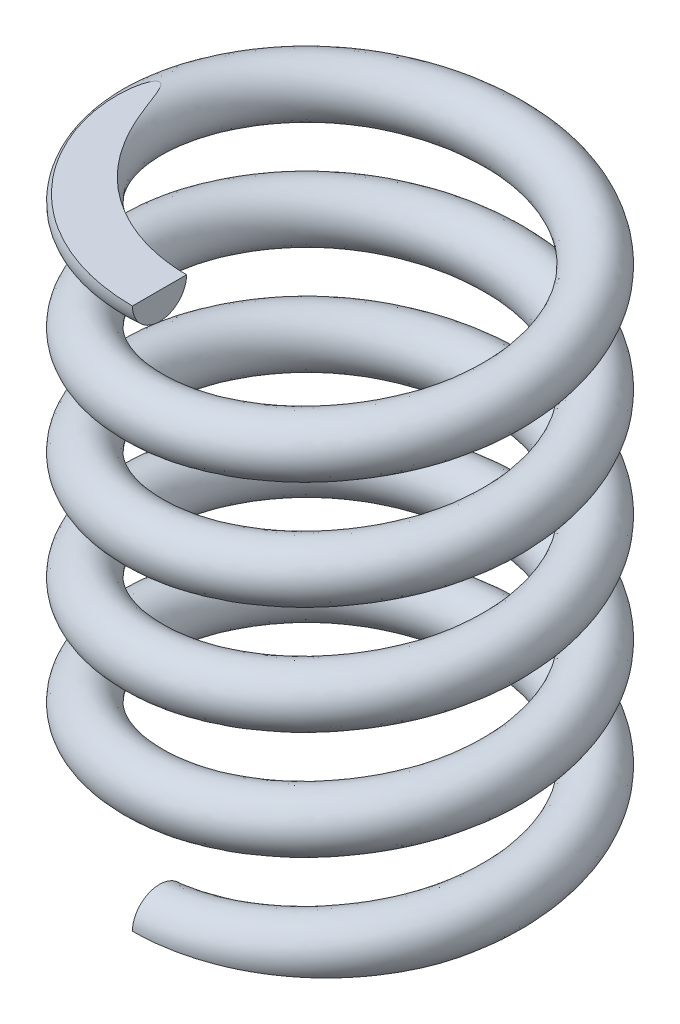
ISO-10303-21;
HEADER;
FILE_DESCRIPTION(('STEP AP214'),'2;1');
FILE_NAME('part.step','',(''),(''),'','','');
FILE_SCHEMA(('AUTOMOTIVE_DESIGN { 1 0 10303 214 1 1 1 1 }'));
ENDSEC;
DATA;
#1=APPLICATION_CONTEXT('core data for automotive mechanical design processes');
#2=APPLICATION_PROTOCOL_DEFINITION('international standard','automotive_design',2000,#1);
#3=PRODUCT_CONTEXT('',#1,'mechanical');
#4=PRODUCT('Part','Part','',(#3));
#5=PRODUCT_RELATED_PRODUCT_CATEGORY('part','',(#4));
#6=PRODUCT_DEFINITION_FORMATION('','',#4);
#7=PRODUCT_DEFINITION_CONTEXT('part definition',#1,'design');
#8=PRODUCT_DEFINITION('design','',#6,#7);
#9=PRODUCT_DEFINITION_SHAPE('','',#8);
#10=(LENGTH_UNIT() NAMED_UNIT(*) SI_UNIT(.MILLI.,.METRE.));
#11=(NAMED_UNIT(*) PLANE_ANGLE_UNIT() SI_UNIT($,.RADIAN.));
#12=(NAMED_UNIT(*) SI_UNIT($,.STERADIAN.) SOLID_ANGLE_UNIT());
#13=UNCERTAINTY_MEASURE_WITH_UNIT(LENGTH_MEASURE(1.E-05),#10,'distance_accuracy_value','');
#14=(GEOMETRIC_REPRESENTATION_CONTEXT(3) GLOBAL_UNCERTAINTY_ASSIGNED_CONTEXT((#13)) GLOBAL_UNIT_ASSIGNED_CONTEXT((#10,
#11,#12)) REPRESENTATION_CONTEXT('',''));
#15=CARTESIAN_POINT('',(0.,0.,0.));
#16=DIRECTION('',(0.,0.,1.));
#17=DIRECTION('',(1.,0.,0.));
#18=AXIS2_PLACEMENT_3D('',#15,#16,#17);
#19=CARTESIAN_POINT('',(0.,3.,1.));
#20=DIRECTION('',(1.,0.,0.));
#21=DIRECTION('',(0.,0.,-1.));
#22=AXIS2_PLACEMENT_3D('',#19,#20,#21);
#23=PLANE('',#22);
#24=CARTESIAN_POINT('',(0.,3.,1.));
#25=DIRECTION('',(1.,0.,0.));
#26=DIRECTION('',(0.,0.,-1.));
#27=AXIS2_PLACEMENT_3D('',#24,#25,#26);
#28=CIRCLE('',#27,0.15);
#29=CARTESIAN_POINT('',(0.,3.,1.15));
#30=VERTEX_POINT('',#29);
#31=CARTESIAN_POINT('',(0.,3.,0.85));
#32=VERTEX_POINT('',#31);
#33=EDGE_CURVE('E73',#30,#32,#28,.T.);
#34=ORIENTED_EDGE('',*,*,#33,.T.);
#35=DIRECTION('',(0.,0.,1.));
#36=VECTOR('',#35,1.);
#37=CARTESIAN_POINT('',(0.,3.,1.));
#38=LINE('',#37,#36);
#39=EDGE_CURVE('E59',#32,#30,#38,.T.);
#40=ORIENTED_EDGE('',*,*,#39,.T.);
#41=EDGE_LOOP('',(#34,#40));
#42=FACE_BOUND('',#41,.T.);
#43=ADVANCED_FACE('F39',(#42),#23,.T.);
#44=CARTESIAN_POINT('',(0.,0.,0.85));
#45=CARTESIAN_POINT('',(0.490747728811182,0.0499999999999999,0.85));
#46=CARTESIAN_POINT('',(0.736121593216773,0.0999999999999999,0.425));
#47=CARTESIAN_POINT('',(0.981495457622364,0.15,0.));
#48=CARTESIAN_POINT('',(0.736121593216773,0.2,-0.425));
#49=CARTESIAN_POINT('',(0.490747728811182,0.25,-0.85));
#50=CARTESIAN_POINT('',(0.,0.3,-0.85));
#51=CARTESIAN_POINT('',(-0.490747728811182,0.35,-0.85));
#52=CARTESIAN_POINT('',(-0.736121593216773,0.399999999999999,-0.425));
#53=CARTESIAN_POINT('',(-0.981495457622364,0.449999999999999,0.));
#54=CARTESIAN_POINT('',(-0.736121593216773,0.499999999999999,0.424999999999999));
#55=CARTESIAN_POINT('',(-0.490747728811182,0.549999999999999,0.85));
#56=CARTESIAN_POINT('',(0.,0.599999999999999,0.85));
#57=CARTESIAN_POINT('',(0.490747728811182,0.649999999999999,0.85));
#58=CARTESIAN_POINT('',(0.736121593216773,0.699999999999999,0.425));
#59=CARTESIAN_POINT('',(0.981495457622364,0.749999999999999,0.));
#60=CARTESIAN_POINT('',(0.736121593216773,0.799999999999999,-0.425));
#61=CARTESIAN_POINT('',(0.490747728811182,0.849999999999999,-0.85));
#62=CARTESIAN_POINT('',(0.,0.899999999999999,-0.85));
#63=CARTESIAN_POINT('',(-0.490747728811182,0.949999999999999,-0.85));
#64=CARTESIAN_POINT('',(-0.736121593216773,0.999999999999999,-0.425));
#65=CARTESIAN_POINT('',(-0.981495457622364,1.05,0.));
#66=CARTESIAN_POINT('',(-0.736121593216773,1.1,0.424999999999999));
#67=CARTESIAN_POINT('',(-0.490747728811182,1.15,0.85));
#68=CARTESIAN_POINT('',(0.,1.2,0.85));
#69=CARTESIAN_POINT('',(0.490747728811182,1.25,0.85));
#70=CARTESIAN_POINT('',(0.736121593216773,1.3,0.425));
#71=CARTESIAN_POINT('',(0.981495457622364,1.35,0.));
#72=CARTESIAN_POINT('',(0.736121593216773,1.4,-0.425));
#73=CARTESIAN_POINT('',(0.490747728811182,1.45,-0.85));
#74=CARTESIAN_POINT('',(0.,1.5,-0.85));
#75=CARTESIAN_POINT('',(-0.490747728811182,1.55,-0.85));
#76=CARTESIAN_POINT('',(-0.736121593216773,1.6,-0.425));
#77=CARTESIAN_POINT('',(-0.981495457622364,1.65,0.));
#78=CARTESIAN_POINT('',(-0.736121593216773,1.7,0.424999999999999));
#79=CARTESIAN_POINT('',(-0.490747728811182,1.75,0.85));
#80=CARTESIAN_POINT('',(0.,1.8,0.85));
#81=CARTESIAN_POINT('',(0.490747728811182,1.85,0.85));
#82=CARTESIAN_POINT('',(0.736121593216773,1.9,0.425));
#83=CARTESIAN_POINT('',(0.981495457622364,1.95,0.));
#84=CARTESIAN_POINT('',(0.736121593216773,2.,-0.425));
#85=CARTESIAN_POINT('',(0.490747728811182,2.05,-0.85));
#86=CARTESIAN_POINT('',(0.,2.1,-0.85));
#87=CARTESIAN_POINT('',(-0.490747728811182,2.15,-0.85));
#88=CARTESIAN_POINT('',(-0.736121593216773,2.2,-0.425));
#89=CARTESIAN_POINT('',(-0.981495457622364,2.25,0.));
#90=CARTESIAN_POINT('',(-0.736121593216773,2.3,0.424999999999999));
#91=CARTESIAN_POINT('',(-0.490747728811182,2.35,0.85));
#92=CARTESIAN_POINT('',(0.,2.4,0.85));
#93=CARTESIAN_POINT('',(0.490747728811182,2.45,0.85));
#94=CARTESIAN_POINT('',(0.736121593216773,2.5,0.425));
#95=CARTESIAN_POINT('',(0.981495457622364,2.55,0.));
#96=CARTESIAN_POINT('',(0.736121593216773,2.6,-0.425));
#97=CARTESIAN_POINT('',(0.490747728811182,2.65,-0.85));
#98=CARTESIAN_POINT('',(0.,2.7,-0.85));
#99=CARTESIAN_POINT('',(-0.490747728811182,2.75,-0.85));
#100=CARTESIAN_POINT('',(-0.736121593216773,2.8,-0.425));
#101=CARTESIAN_POINT('',(-0.981495457622364,2.85,0.));
#102=CARTESIAN_POINT('',(-0.736121593216773,2.9,0.424999999999999));
#103=CARTESIAN_POINT('',(-0.490747728811182,2.95,0.85));
#104=CARTESIAN_POINT('',(0.,3.,0.85));
#105=CARTESIAN_POINT('',(0.,0.3,0.85));
#106=CARTESIAN_POINT('',(0.490747728811182,0.35,0.85));
#107=CARTESIAN_POINT('',(0.736121593216773,0.4,0.425));
#108=CARTESIAN_POINT('',(0.981495457622364,0.45,0.));
#109=CARTESIAN_POINT('',(0.736121593216773,0.5,-0.425));
#110=CARTESIAN_POINT('',(0.490747728811182,0.55,-0.85));
#111=CARTESIAN_POINT('',(0.,0.6,-0.85));
#112=CARTESIAN_POINT('',(-0.490747728811182,0.65,-0.85));
#113=CARTESIAN_POINT('',(-0.736121593216773,0.699999999999999,-0.425));
#114=CARTESIAN_POINT('',(-0.981495457622364,0.749999999999999,0.));
#115=CARTESIAN_POINT('',(-0.736121593216773,0.799999999999999,0.424999999999999));
#116=CARTESIAN_POINT('',(-0.490747728811182,0.849999999999999,0.85));
#117=CARTESIAN_POINT('',(0.,0.899999999999999,0.85));
#118=CARTESIAN_POINT('',(0.490747728811182,0.949999999999999,0.85));
#119=CARTESIAN_POINT('',(0.736121593216773,0.999999999999999,0.425));
#120=CARTESIAN_POINT('',(0.981495457622364,1.05,0.));
#121=CARTESIAN_POINT('',(0.736121593216773,1.1,-0.425));
#122=CARTESIAN_POINT('',(0.490747728811182,1.15,-0.85));
#123=CARTESIAN_POINT('',(0.,1.2,-0.85));
#124=CARTESIAN_POINT('',(-0.490747728811182,1.25,-0.85));
#125=CARTESIAN_POINT('',(-0.736121593216773,1.3,-0.425));
#126=CARTESIAN_POINT('',(-0.981495457622364,1.35,0.));
#127=CARTESIAN_POINT('',(-0.736121593216773,1.4,0.424999999999999));
#128=CARTESIAN_POINT('',(-0.490747728811182,1.45,0.85));
#129=CARTESIAN_POINT('',(0.,1.5,0.85));
#130=CARTESIAN_POINT('',(0.490747728811182,1.55,0.85));
#131=CARTESIAN_POINT('',(0.736121593216773,1.6,0.425));
#132=CARTESIAN_POINT('',(0.981495457622364,1.65,0.));
#133=CARTESIAN_POINT('',(0.736121593216773,1.7,-0.425));
#134=CARTESIAN_POINT('',(0.490747728811182,1.75,-0.85));
#135=CARTESIAN_POINT('',(0.,1.8,-0.85));
#136=CARTESIAN_POINT('',(-0.490747728811182,1.85,-0.85));
#137=CARTESIAN_POINT('',(-0.736121593216773,1.9,-0.425));
#138=CARTESIAN_POINT('',(-0.981495457622364,1.95,0.));
#139=CARTESIAN_POINT('',(-0.736121593216773,2.,0.424999999999999));
#140=CARTESIAN_POINT('',(-0.490747728811182,2.05,0.85));
#141=CARTESIAN_POINT('',(0.,2.1,0.85));
#142=CARTESIAN_POINT('',(0.490747728811182,2.15,0.85));
#143=CARTESIAN_POINT('',(0.736121593216773,2.2,0.425));
#144=CARTESIAN_POINT('',(0.981495457622364,2.25,0.));
#145=CARTESIAN_POINT('',(0.736121593216773,2.3,-0.425));
#146=CARTESIAN_POINT('',(0.490747728811182,2.35,-0.85));
#147=CARTESIAN_POINT('',(0.,2.4,-0.85));
#148=CARTESIAN_POINT('',(-0.490747728811182,2.45,-0.85));
#149=CARTESIAN_POINT('',(-0.736121593216773,2.5,-0.425));
#150=CARTESIAN_POINT('',(-0.981495457622364,2.55,0.));
#151=CARTESIAN_POINT('',(-0.736121593216773,2.6,0.424999999999999));
#152=CARTESIAN_POINT('',(-0.490747728811182,2.65,0.85));
#153=CARTESIAN_POINT('',(0.,2.7,0.85));
#154=CARTESIAN_POINT('',(0.490747728811182,2.75,0.85));
#155=CARTESIAN_POINT('',(0.736121593216773,2.8,0.425));
#156=CARTESIAN_POINT('',(0.981495457622364,2.85,0.));
#157=CARTESIAN_POINT('',(0.736121593216773,2.9,-0.425));
#158=CARTESIAN_POINT('',(0.490747728811182,2.95,-0.85));
#159=CARTESIAN_POINT('',(0.,3.,-0.85));
#160=CARTESIAN_POINT('',(-0.490747728811182,3.05,-0.85));
#161=CARTESIAN_POINT('',(-0.736121593216773,3.1,-0.425));
#162=CARTESIAN_POINT('',(-0.981495457622364,3.15,0.));
#163=CARTESIAN_POINT('',(-0.736121593216773,3.2,0.424999999999999));
#164=CARTESIAN_POINT('',(-0.490747728811182,3.25,0.85));
#165=CARTESIAN_POINT('',(0.,3.3,0.85));
#166=CARTESIAN_POINT('',(0.,0.3,1.15));
#167=CARTESIAN_POINT('',(0.663952809568069,0.35,1.15));
#168=CARTESIAN_POINT('',(0.995929214352104,0.4,0.575));
#169=CARTESIAN_POINT('',(1.32790561913614,0.45,0.));
#170=CARTESIAN_POINT('',(0.995929214352104,0.5,-0.575));
#171=CARTESIAN_POINT('',(0.66395280956807,0.55,-1.15));
#172=CARTESIAN_POINT('',(0.,0.6,-1.15));
#173=CARTESIAN_POINT('',(-0.663952809568069,0.65,-1.15));
#174=CARTESIAN_POINT('',(-0.995929214352104,0.699999999999999,-0.575000000000001));
#175=CARTESIAN_POINT('',(-1.32790561913614,0.749999999999999,0.));
#176=CARTESIAN_POINT('',(-0.995929214352105,0.799999999999999,0.574999999999999));
#177=CARTESIAN_POINT('',(-0.66395280956807,0.849999999999999,1.15));
#178=CARTESIAN_POINT('',(0.,0.899999999999999,1.15));
#179=CARTESIAN_POINT('',(0.663952809568069,0.949999999999999,1.15));
#180=CARTESIAN_POINT('',(0.995929214352104,0.999999999999999,0.575));
#181=CARTESIAN_POINT('',(1.32790561913614,1.05,0.));
#182=CARTESIAN_POINT('',(0.995929214352104,1.1,-0.575));
#183=CARTESIAN_POINT('',(0.66395280956807,1.15,-1.15));
#184=CARTESIAN_POINT('',(0.,1.2,-1.15));
#185=CARTESIAN_POINT('',(-0.663952809568069,1.25,-1.15));
#186=CARTESIAN_POINT('',(-0.995929214352104,1.3,-0.575000000000001));
#187=CARTESIAN_POINT('',(-1.32790561913614,1.35,0.));
#188=CARTESIAN_POINT('',(-0.995929214352105,1.4,0.574999999999999));
#189=CARTESIAN_POINT('',(-0.66395280956807,1.45,1.15));
#190=CARTESIAN_POINT('',(0.,1.5,1.15));
#191=CARTESIAN_POINT('',(0.663952809568069,1.55,1.15));
#192=CARTESIAN_POINT('',(0.995929214352104,1.6,0.575));
#193=CARTESIAN_POINT('',(1.32790561913614,1.65,0.));
#194=CARTESIAN_POINT('',(0.995929214352104,1.7,-0.575));
#195=CARTESIAN_POINT('',(0.66395280956807,1.75,-1.15));
#196=CARTESIAN_POINT('',(0.,1.8,-1.15));
#197=CARTESIAN_POINT('',(-0.663952809568069,1.85,-1.15));
#198=CARTESIAN_POINT('',(-0.995929214352104,1.9,-0.575000000000001));
#199=CARTESIAN_POINT('',(-1.32790561913614,1.95,0.));
#200=CARTESIAN_POINT('',(-0.995929214352105,2.,0.574999999999999));
#201=CARTESIAN_POINT('',(-0.66395280956807,2.05,1.15));
#202=CARTESIAN_POINT('',(0.,2.1,1.15));
#203=CARTESIAN_POINT('',(0.663952809568069,2.15,1.15));
#204=CARTESIAN_POINT('',(0.995929214352104,2.2,0.575));
#205=CARTESIAN_POINT('',(1.32790561913614,2.25,0.));
#206=CARTESIAN_POINT('',(0.995929214352104,2.3,-0.575));
#207=CARTESIAN_POINT('',(0.66395280956807,2.35,-1.15));
#208=CARTESIAN_POINT('',(0.,2.4,-1.15));
#209=CARTESIAN_POINT('',(-0.663952809568069,2.45,-1.15));
#210=CARTESIAN_POINT('',(-0.995929214352104,2.5,-0.575000000000001));
#211=CARTESIAN_POINT('',(-1.32790561913614,2.55,0.));
#212=CARTESIAN_POINT('',(-0.995929214352105,2.6,0.574999999999999));
#213=CARTESIAN_POINT('',(-0.66395280956807,2.65,1.15));
#214=CARTESIAN_POINT('',(0.,2.7,1.15));
#215=CARTESIAN_POINT('',(0.663952809568069,2.75,1.15));
#216=CARTESIAN_POINT('',(0.995929214352104,2.8,0.575));
#217=CARTESIAN_POINT('',(1.32790561913614,2.85,0.));
#218=CARTESIAN_POINT('',(0.995929214352104,2.9,-0.575));
#219=CARTESIAN_POINT('',(0.66395280956807,2.95,-1.15));
#220=CARTESIAN_POINT('',(0.,3.,-1.15));
#221=CARTESIAN_POINT('',(-0.663952809568069,3.05,-1.15));
#222=CARTESIAN_POINT('',(-0.995929214352104,3.1,-0.575000000000001));
#223=CARTESIAN_POINT('',(-1.32790561913614,3.15,0.));
#224=CARTESIAN_POINT('',(-0.995929214352105,3.2,0.574999999999999));
#225=CARTESIAN_POINT('',(-0.66395280956807,3.25,1.15));
#226=CARTESIAN_POINT('',(0.,3.3,1.15));
#227=CARTESIAN_POINT('',(0.,0.,1.15));
#228=CARTESIAN_POINT('',(0.663952809568069,0.05,1.15));
#229=CARTESIAN_POINT('',(0.995929214352104,0.0999999999999999,0.575));
#230=CARTESIAN_POINT('',(1.32790561913614,0.15,0.));
#231=CARTESIAN_POINT('',(0.995929214352104,0.2,-0.575));
#232=CARTESIAN_POINT('',(0.66395280956807,0.25,-1.15));
#233=CARTESIAN_POINT('',(0.,0.3,-1.15));
#234=CARTESIAN_POINT('',(-0.663952809568069,0.35,-1.15));
#235=CARTESIAN_POINT('',(-0.995929214352104,0.399999999999999,-0.575000000000001));
#236=CARTESIAN_POINT('',(-1.32790561913614,0.449999999999999,0.));
#237=CARTESIAN_POINT('',(-0.995929214352105,0.499999999999999,0.574999999999999));
#238=CARTESIAN_POINT('',(-0.66395280956807,0.549999999999999,1.15));
#239=CARTESIAN_POINT('',(0.,0.599999999999999,1.15));
#240=CARTESIAN_POINT('',(0.663952809568069,0.649999999999999,1.15));
#241=CARTESIAN_POINT('',(0.995929214352104,0.699999999999999,0.575));
#242=CARTESIAN_POINT('',(1.32790561913614,0.749999999999999,0.));
#243=CARTESIAN_POINT('',(0.995929214352104,0.799999999999999,-0.575));
#244=CARTESIAN_POINT('',(0.66395280956807,0.849999999999999,-1.15));
#245=CARTESIAN_POINT('',(0.,0.899999999999999,-1.15));
#246=CARTESIAN_POINT('',(-0.663952809568069,0.949999999999999,-1.15));
#247=CARTESIAN_POINT('',(-0.995929214352104,0.999999999999999,-0.575000000000001));
#248=CARTESIAN_POINT('',(-1.32790561913614,1.05,0.));
#249=CARTESIAN_POINT('',(-0.995929214352105,1.1,0.574999999999999));
#250=CARTESIAN_POINT('',(-0.66395280956807,1.15,1.15));
#251=CARTESIAN_POINT('',(0.,1.2,1.15));
#252=CARTESIAN_POINT('',(0.663952809568069,1.25,1.15));
#253=CARTESIAN_POINT('',(0.995929214352104,1.3,0.575));
#254=CARTESIAN_POINT('',(1.32790561913614,1.35,0.));
#255=CARTESIAN_POINT('',(0.995929214352104,1.4,-0.575));
#256=CARTESIAN_POINT('',(0.66395280956807,1.45,-1.15));
#257=CARTESIAN_POINT('',(0.,1.5,-1.15));
#258=CARTESIAN_POINT('',(-0.663952809568069,1.55,-1.15));
#259=CARTESIAN_POINT('',(-0.995929214352104,1.6,-0.575000000000001));
#260=CARTESIAN_POINT('',(-1.32790561913614,1.65,0.));
#261=CARTESIAN_POINT('',(-0.995929214352105,1.7,0.574999999999999));
#262=CARTESIAN_POINT('',(-0.66395280956807,1.75,1.15));
#263=CARTESIAN_POINT('',(0.,1.8,1.15));
#264=CARTESIAN_POINT('',(0.663952809568069,1.85,1.15));
#265=CARTESIAN_POINT('',(0.995929214352104,1.9,0.575));
#266=CARTESIAN_POINT('',(1.32790561913614,1.95,0.));
#267=CARTESIAN_POINT('',(0.995929214352104,2.,-0.575));
#268=CARTESIAN_POINT('',(0.66395280956807,2.05,-1.15));
#269=CARTESIAN_POINT('',(0.,2.1,-1.15));
#270=CARTESIAN_POINT('',(-0.663952809568069,2.15,-1.15));
#271=CARTESIAN_POINT('',(-0.995929214352104,2.2,-0.575000000000001));
#272=CARTESIAN_POINT('',(-1.32790561913614,2.25,0.));
#273=CARTESIAN_POINT('',(-0.995929214352105,2.3,0.574999999999999));
#274=CARTESIAN_POINT('',(-0.66395280956807,2.35,1.15));
#275=CARTESIAN_POINT('',(0.,2.4,1.15));
#276=CARTESIAN_POINT('',(0.663952809568069,2.45,1.15));
#277=CARTESIAN_POINT('',(0.995929214352104,2.5,0.575));
#278=CARTESIAN_POINT('',(1.32790561913614,2.55,0.));
#279=CARTESIAN_POINT('',(0.995929214352104,2.6,-0.575));
#280=CARTESIAN_POINT('',(0.66395280956807,2.65,-1.15));
#281=CARTESIAN_POINT('',(0.,2.7,-1.15));
#282=CARTESIAN_POINT('',(-0.663952809568069,2.75,-1.15));
#283=CARTESIAN_POINT('',(-0.995929214352104,2.8,-0.575000000000001));
#284=CARTESIAN_POINT('',(-1.32790561913614,2.85,0.));
#285=CARTESIAN_POINT('',(-0.995929214352105,2.9,0.574999999999999));
#286=CARTESIAN_POINT('',(-0.66395280956807,2.95,1.15));
#287=CARTESIAN_POINT('',(0.,3.,1.15));
#288=CARTESIAN_POINT('',(0.,-0.3,1.15));
#289=CARTESIAN_POINT('',(0.663952809568069,-0.25,1.15));
#290=CARTESIAN_POINT('',(0.995929214352104,-0.2,0.575));
#291=CARTESIAN_POINT('',(1.32790561913614,-0.15,0.));
#292=CARTESIAN_POINT('',(0.995929214352104,-0.1,-0.575));
#293=CARTESIAN_POINT('',(0.66395280956807,-0.0500000000000004,-1.15));
#294=CARTESIAN_POINT('',(0.,0.,-1.15));
#295=CARTESIAN_POINT('',(-0.663952809568069,0.0499999999999995,-1.15));
#296=CARTESIAN_POINT('',(-0.995929214352104,0.0999999999999995,-0.575000000000001));
#297=CARTESIAN_POINT('',(-1.32790561913614,0.149999999999999,0.));
#298=CARTESIAN_POINT('',(-0.995929214352105,0.199999999999999,0.574999999999999));
#299=CARTESIAN_POINT('',(-0.66395280956807,0.249999999999999,1.15));
#300=CARTESIAN_POINT('',(0.,0.299999999999999,1.15));
#301=CARTESIAN_POINT('',(0.663952809568069,0.349999999999999,1.15));
#302=CARTESIAN_POINT('',(0.995929214352104,0.399999999999999,0.575));
#303=CARTESIAN_POINT('',(1.32790561913614,0.449999999999999,0.));
#304=CARTESIAN_POINT('',(0.995929214352104,0.499999999999999,-0.575));
#305=CARTESIAN_POINT('',(0.66395280956807,0.549999999999999,-1.15));
#306=CARTESIAN_POINT('',(0.,0.599999999999999,-1.15));
#307=CARTESIAN_POINT('',(-0.663952809568069,0.649999999999999,-1.15));
#308=CARTESIAN_POINT('',(-0.995929214352104,0.699999999999999,-0.575000000000001));
#309=CARTESIAN_POINT('',(-1.32790561913614,0.749999999999999,0.));
#310=CARTESIAN_POINT('',(-0.995929214352105,0.799999999999998,0.574999999999999));
#311=CARTESIAN_POINT('',(-0.66395280956807,0.849999999999999,1.15));
#312=CARTESIAN_POINT('',(0.,0.899999999999998,1.15));
#313=CARTESIAN_POINT('',(0.663952809568069,0.949999999999998,1.15));
#314=CARTESIAN_POINT('',(0.995929214352104,0.999999999999998,0.575));
#315=CARTESIAN_POINT('',(1.32790561913614,1.05,0.));
#316=CARTESIAN_POINT('',(0.995929214352104,1.1,-0.575));
#317=CARTESIAN_POINT('',(0.66395280956807,1.15,-1.15));
#318=CARTESIAN_POINT('',(0.,1.2,-1.15));
#319=CARTESIAN_POINT('',(-0.663952809568069,1.25,-1.15));
#320=CARTESIAN_POINT('',(-0.995929214352104,1.3,-0.575000000000001));
#321=CARTESIAN_POINT('',(-1.32790561913614,1.35,0.));
#322=CARTESIAN_POINT('',(-0.995929214352105,1.4,0.574999999999999));
#323=CARTESIAN_POINT('',(-0.66395280956807,1.45,1.15));
#324=CARTESIAN_POINT('',(0.,1.5,1.15));
#325=CARTESIAN_POINT('',(0.663952809568069,1.55,1.15));
#326=CARTESIAN_POINT('',(0.995929214352104,1.6,0.575));
#327=CARTESIAN_POINT('',(1.32790561913614,1.65,0.));
#328=CARTESIAN_POINT('',(0.995929214352104,1.7,-0.575));
#329=CARTESIAN_POINT('',(0.66395280956807,1.75,-1.15));
#330=CARTESIAN_POINT('',(0.,1.8,-1.15));
#331=CARTESIAN_POINT('',(-0.663952809568069,1.85,-1.15));
#332=CARTESIAN_POINT('',(-0.995929214352104,1.9,-0.575000000000001));
#333=CARTESIAN_POINT('',(-1.32790561913614,1.95,0.));
#334=CARTESIAN_POINT('',(-0.995929214352105,2.,0.574999999999999));
#335=CARTESIAN_POINT('',(-0.66395280956807,2.05,1.15));
#336=CARTESIAN_POINT('',(0.,2.1,1.15));
#337=CARTESIAN_POINT('',(0.663952809568069,2.15,1.15));
#338=CARTESIAN_POINT('',(0.995929214352104,2.2,0.575));
#339=CARTESIAN_POINT('',(1.32790561913614,2.25,0.));
#340=CARTESIAN_POINT('',(0.995929214352104,2.3,-0.575));
#341=CARTESIAN_POINT('',(0.66395280956807,2.35,-1.15));
#342=CARTESIAN_POINT('',(0.,2.4,-1.15));
#343=CARTESIAN_POINT('',(-0.663952809568069,2.45,-1.15));
#344=CARTESIAN_POINT('',(-0.995929214352104,2.5,-0.575000000000001));
#345=CARTESIAN_POINT('',(-1.32790561913614,2.55,0.));
#346=CARTESIAN_POINT('',(-0.995929214352105,2.6,0.574999999999999));
#347=CARTESIAN_POINT('',(-0.66395280956807,2.65,1.15));
#348=CARTESIAN_POINT('',(0.,2.7,1.15));
#349=CARTESIAN_POINT('',(0.,-0.3,0.85));
#350=CARTESIAN_POINT('',(0.490747728811182,-0.25,0.85));
#351=CARTESIAN_POINT('',(0.736121593216773,-0.2,0.425));
#352=CARTESIAN_POINT('',(0.981495457622364,-0.15,0.));
#353=CARTESIAN_POINT('',(0.736121593216773,-0.1,-0.425));
#354=CARTESIAN_POINT('',(0.490747728811182,-0.0500000000000004,-0.85));
#355=CARTESIAN_POINT('',(0.,0.,-0.85));
#356=CARTESIAN_POINT('',(-0.490747728811182,0.0499999999999995,-0.85));
#357=CARTESIAN_POINT('',(-0.736121593216773,0.0999999999999995,-0.425));
#358=CARTESIAN_POINT('',(-0.981495457622364,0.149999999999999,0.));
#359=CARTESIAN_POINT('',(-0.736121593216773,0.199999999999999,0.424999999999999));
#360=CARTESIAN_POINT('',(-0.490747728811182,0.249999999999999,0.85));
#361=CARTESIAN_POINT('',(0.,0.299999999999999,0.85));
#362=CARTESIAN_POINT('',(0.490747728811182,0.349999999999999,0.85));
#363=CARTESIAN_POINT('',(0.736121593216773,0.399999999999999,0.425));
#364=CARTESIAN_POINT('',(0.981495457622364,0.449999999999999,0.));
#365=CARTESIAN_POINT('',(0.736121593216773,0.499999999999999,-0.425));
#366=CARTESIAN_POINT('',(0.490747728811182,0.549999999999999,-0.85));
#367=CARTESIAN_POINT('',(0.,0.599999999999999,-0.85));
#368=CARTESIAN_POINT('',(-0.490747728811182,0.649999999999999,-0.85));
#369=CARTESIAN_POINT('',(-0.736121593216773,0.699999999999999,-0.425));
#370=CARTESIAN_POINT('',(-0.981495457622364,0.749999999999999,0.));
#371=CARTESIAN_POINT('',(-0.736121593216773,0.799999999999998,0.424999999999999));
#372=CARTESIAN_POINT('',(-0.490747728811182,0.849999999999999,0.85));
#373=CARTESIAN_POINT('',(0.,0.899999999999998,0.85));
#374=CARTESIAN_POINT('',(0.490747728811182,0.949999999999998,0.85));
#375=CARTESIAN_POINT('',(0.736121593216773,0.999999999999998,0.425));
#376=CARTESIAN_POINT('',(0.981495457622364,1.05,0.));
#377=CARTESIAN_POINT('',(0.736121593216773,1.1,-0.425));
#378=CARTESIAN_POINT('',(0.490747728811182,1.15,-0.85));
#379=CARTESIAN_POINT('',(0.,1.2,-0.85));
#380=CARTESIAN_POINT('',(-0.490747728811182,1.25,-0.85));
#381=CARTESIAN_POINT('',(-0.736121593216773,1.3,-0.425));
#382=CARTESIAN_POINT('',(-0.981495457622364,1.35,0.));
#383=CARTESIAN_POINT('',(-0.736121593216773,1.4,0.424999999999999));
#384=CARTESIAN_POINT('',(-0.490747728811182,1.45,0.85));
#385=CARTESIAN_POINT('',(0.,1.5,0.85));
#386=CARTESIAN_POINT('',(0.490747728811182,1.55,0.85));
#387=CARTESIAN_POINT('',(0.736121593216773,1.6,0.425));
#388=CARTESIAN_POINT('',(0.981495457622364,1.65,0.));
#389=CARTESIAN_POINT('',(0.736121593216773,1.7,-0.425));
#390=CARTESIAN_POINT('',(0.490747728811182,1.75,-0.85));
#391=CARTESIAN_POINT('',(0.,1.8,-0.85));
#392=CARTESIAN_POINT('',(-0.490747728811182,1.85,-0.85));
#393=CARTESIAN_POINT('',(-0.736121593216773,1.9,-0.425));
#394=CARTESIAN_POINT('',(-0.981495457622364,1.95,0.));
#395=CARTESIAN_POINT('',(-0.736121593216773,2.,0.424999999999999));
#396=CARTESIAN_POINT('',(-0.490747728811182,2.05,0.85));
#397=CARTESIAN_POINT('',(0.,2.1,0.85));
#398=CARTESIAN_POINT('',(0.490747728811182,2.15,0.85));
#399=CARTESIAN_POINT('',(0.736121593216773,2.2,0.425));
#400=CARTESIAN_POINT('',(0.981495457622364,2.25,0.));
#401=CARTESIAN_POINT('',(0.736121593216773,2.3,-0.425));
#402=CARTESIAN_POINT('',(0.490747728811182,2.35,-0.85));
#403=CARTESIAN_POINT('',(0.,2.4,-0.85));
#404=CARTESIAN_POINT('',(-0.490747728811182,2.45,-0.85));
#405=CARTESIAN_POINT('',(-0.736121593216773,2.5,-0.425));
#406=CARTESIAN_POINT('',(-0.981495457622364,2.55,0.));
#407=CARTESIAN_POINT('',(-0.736121593216773,2.6,0.424999999999999));
#408=CARTESIAN_POINT('',(-0.490747728811182,2.65,0.85));
#409=CARTESIAN_POINT('',(0.,2.7,0.85));
#410=CARTESIAN_POINT('',(0.,0.,0.85));
#411=CARTESIAN_POINT('',(0.490747728811182,0.0499999999999999,0.85));
#412=CARTESIAN_POINT('',(0.736121593216773,0.0999999999999999,0.425));
#413=CARTESIAN_POINT('',(0.981495457622364,0.15,0.));
#414=CARTESIAN_POINT('',(0.736121593216773,0.2,-0.425));
#415=CARTESIAN_POINT('',(0.490747728811182,0.25,-0.85));
#416=CARTESIAN_POINT('',(0.,0.3,-0.85));
#417=CARTESIAN_POINT('',(-0.490747728811182,0.35,-0.85));
#418=CARTESIAN_POINT('',(-0.736121593216773,0.399999999999999,-0.425));
#419=CARTESIAN_POINT('',(-0.981495457622364,0.449999999999999,0.));
#420=CARTESIAN_POINT('',(-0.736121593216773,0.499999999999999,0.424999999999999));
#421=CARTESIAN_POINT('',(-0.490747728811182,0.549999999999999,0.85));
#422=CARTESIAN_POINT('',(0.,0.599999999999999,0.85));
#423=CARTESIAN_POINT('',(0.490747728811182,0.649999999999999,0.85));
#424=CARTESIAN_POINT('',(0.736121593216773,0.699999999999999,0.425));
#425=CARTESIAN_POINT('',(0.981495457622364,0.749999999999999,0.));
#426=CARTESIAN_POINT('',(0.736121593216773,0.799999999999999,-0.425));
#427=CARTESIAN_POINT('',(0.490747728811182,0.849999999999999,-0.85));
#428=CARTESIAN_POINT('',(0.,0.899999999999999,-0.85));
#429=CARTESIAN_POINT('',(-0.490747728811182,0.949999999999999,-0.85));
#430=CARTESIAN_POINT('',(-0.736121593216773,0.999999999999999,-0.425));
#431=CARTESIAN_POINT('',(-0.981495457622364,1.05,0.));
#432=CARTESIAN_POINT('',(-0.736121593216773,1.1,0.424999999999999));
#433=CARTESIAN_POINT('',(-0.490747728811182,1.15,0.85));
#434=CARTESIAN_POINT('',(0.,1.2,0.85));
#435=CARTESIAN_POINT('',(0.490747728811182,1.25,0.85));
#436=CARTESIAN_POINT('',(0.736121593216773,1.3,0.425));
#437=CARTESIAN_POINT('',(0.981495457622364,1.35,0.));
#438=CARTESIAN_POINT('',(0.736121593216773,1.4,-0.425));
#439=CARTESIAN_POINT('',(0.490747728811182,1.45,-0.85));
#440=CARTESIAN_POINT('',(0.,1.5,-0.85));
#441=CARTESIAN_POINT('',(-0.490747728811182,1.55,-0.85));
#442=CARTESIAN_POINT('',(-0.736121593216773,1.6,-0.425));
#443=CARTESIAN_POINT('',(-0.981495457622364,1.65,0.));
#444=CARTESIAN_POINT('',(-0.736121593216773,1.7,0.424999999999999));
#445=CARTESIAN_POINT('',(-0.490747728811182,1.75,0.85));
#446=CARTESIAN_POINT('',(0.,1.8,0.85));
#447=CARTESIAN_POINT('',(0.490747728811182,1.85,0.85));
#448=CARTESIAN_POINT('',(0.736121593216773,1.9,0.425));
#449=CARTESIAN_POINT('',(0.981495457622364,1.95,0.));
#450=CARTESIAN_POINT('',(0.736121593216773,2.,-0.425));
#451=CARTESIAN_POINT('',(0.490747728811182,2.05,-0.85));
#452=CARTESIAN_POINT('',(0.,2.1,-0.85));
#453=CARTESIAN_POINT('',(-0.490747728811182,2.15,-0.85));
#454=CARTESIAN_POINT('',(-0.736121593216773,2.2,-0.425));
#455=CARTESIAN_POINT('',(-0.981495457622364,2.25,0.));
#456=CARTESIAN_POINT('',(-0.736121593216773,2.3,0.424999999999999));
#457=CARTESIAN_POINT('',(-0.490747728811182,2.35,0.85));
#458=CARTESIAN_POINT('',(0.,2.4,0.85));
#459=CARTESIAN_POINT('',(0.490747728811182,2.45,0.85));
#460=CARTESIAN_POINT('',(0.736121593216773,2.5,0.425));
#461=CARTESIAN_POINT('',(0.981495457622364,2.55,0.));
#462=CARTESIAN_POINT('',(0.736121593216773,2.6,-0.425));
#463=CARTESIAN_POINT('',(0.490747728811182,2.65,-0.85));
#464=CARTESIAN_POINT('',(0.,2.7,-0.85));
#465=CARTESIAN_POINT('',(-0.490747728811182,2.75,-0.85));
#466=CARTESIAN_POINT('',(-0.736121593216773,2.8,-0.425));
#467=CARTESIAN_POINT('',(-0.981495457622364,2.85,0.));
#468=CARTESIAN_POINT('',(-0.736121593216773,2.9,0.424999999999999));
#469=CARTESIAN_POINT('',(-0.490747728811182,2.95,0.85));
#470=CARTESIAN_POINT('',(0.,3.,0.85));
#471=(BOUNDED_SURFACE() B_SPLINE_SURFACE(3,2,((#44,#45,#46,#47,#48,#49,#50,#51,#52,#53,#54,#55,
#56,#57,#58,#59,#60,#61,#62,#63,#64,#65,#66,#67,#68,#69,#70,#71,#72,#73,#74,#75,#76,#77,#78,#79,
#80,#81,#82,#83,#84,#85,#86,#87,#88,#89,#90,#91,#92,#93,#94,#95,#96,#97,#98,#99,#100,#101,#102,
#103,#104),(#105,#106,#107,#108,#109,#110,#111,#112,#113,#114,#115,#116,#117,#118,#119,#120,
#121,#122,#123,#124,#125,#126,#127,#128,#129,#130,#131,#132,#133,#134,#135,#136,#137,#138,#139,
#140,#141,#142,#143,#144,#145,#146,#147,#148,#149,#150,#151,#152,#153,#154,#155,#156,#157,#158,
#159,#160,#161,#162,#163,#164,#165),(#166,#167,#168,#169,#170,#171,#172,#173,#174,#175,#176,
#177,#178,#179,#180,#181,#182,#183,#184,#185,#186,#187,#188,#189,#190,#191,#192,#193,#194,#195,
#196,#197,#198,#199,#200,#201,#202,#203,#204,#205,#206,#207,#208,#209,#210,#211,#212,#213,#214,
#215,#216,#217,#218,#219,#220,#221,#222,#223,#224,#225,#226),(#227,#228,#229,#230,#231,#232,
#233,#234,#235,#236,#237,#238,#239,#240,#241,#242,#243,#244,#245,#246,#247,#248,#249,#250,#251,
#252,#253,#254,#255,#256,#257,#258,#259,#260,#261,#262,#263,#264,#265,#266,#267,#268,#269,#270,
#271,#272,#273,#274,#275,#276,#277,#278,#279,#280,#281,#282,#283,#284,#285,#286,#287),(#288,
#289,#290,#291,#292,#293,#294,#295,#296,#297,#298,#299,#300,#301,#302,#303,#304,#305,#306,#307,
#308,#309,#310,#311,#312,#313,#314,#315,#316,#317,#318,#319,#320,#321,#322,#323,#324,#325,#326,
#327,#328,#329,#330,#331,#332,#333,#334,#335,#336,#337,#338,#339,#340,#341,#342,#343,#344,#345,
#346,#347,#348),(#349,#350,#351,#352,#353,#354,#355,#356,#357,#358,#359,#360,#361,#362,#363,
#364,#365,#366,#367,#368,#369,#370,#371,#372,#373,#374,#375,#376,#377,#378,#379,#380,#381,#382,
#383,#384,#385,#386,#387,#388,#389,#390,#391,#392,#393,#394,#395,#396,#397,#398,#399,#400,#401,
#402,#403,#404,#405,#406,#407,#408,#409),(#410,#411,#412,#413,#414,#415,#416,#417,#418,#419,
#420,#421,#422,#423,#424,#425,#426,#427,#428,#429,#430,#431,#432,#433,#434,#435,#436,#437,#438,
#439,#440,#441,#442,#443,#444,#445,#446,#447,#448,#449,#450,#451,#452,#453,#454,#455,#456,#457,
#458,#459,#460,#461,#462,#463,#464,#465,#466,#467,#468,#469,#470)),.UNSPECIFIED.,.T.,.F.,
.F.) B_SPLINE_SURFACE_WITH_KNOTS((4,3,4),(3,2,2,2,2,2,2,2,2,2,2,2,2,2,2,2,2,2,2,2,2,2,2,2,2,2,2,
2,2,2,3),(0.,0.5,1.),(0.,0.0333333333333333,0.0666666666666667,0.1,0.133333333333333,
0.166666666666667,0.2,0.233333333333333,0.266666666666667,0.3,0.333333333333333,
0.366666666666667,0.4,0.433333333333333,0.466666666666667,0.5,0.533333333333333,
0.566666666666667,0.6,0.633333333333333,0.666666666666667,0.7,0.733333333333333,
0.766666666666667,0.8,0.833333333333333,0.866666666666667,0.9,0.933333333333333,
0.966666666666667,1.),
.UNSPECIFIED.) GEOMETRIC_REPRESENTATION_ITEM() RATIONAL_B_SPLINE_SURFACE(((1.,0.866025403784439,
1.,0.866025403784439,1.,0.866025403784439,1.,0.866025403784439,1.,0.866025403784439,1.,
0.866025403784439,1.,0.866025403784439,1.,0.866025403784439,1.,0.866025403784439,1.,
0.866025403784439,1.,0.866025403784439,1.,0.866025403784439,1.,0.866025403784439,1.,
0.866025403784439,1.,0.866025403784439,1.,0.866025403784439,1.,0.866025403784439,1.,
0.866025403784439,1.,0.866025403784439,1.,0.866025403784439,1.,0.866025403784439,1.,
0.866025403784439,1.,0.866025403784439,1.,0.866025403784439,1.,0.866025403784439,1.,
0.866025403784439,1.,0.866025403784439,1.,0.866025403784439,1.,0.866025403784439,1.,
0.866025403784439,1.),(0.333333333333333,0.288675134594813,0.333333333333333,0.288675134594813,
0.333333333333333,0.288675134594813,0.333333333333333,0.288675134594813,0.333333333333333,
0.288675134594813,0.333333333333333,0.288675134594813,0.333333333333333,0.288675134594813,
0.333333333333333,0.288675134594813,0.333333333333333,0.288675134594813,0.333333333333333,
0.288675134594813,0.333333333333333,0.288675134594813,0.333333333333333,0.288675134594813,
0.333333333333333,0.288675134594813,0.333333333333333,0.288675134594813,0.333333333333333,
0.288675134594813,0.333333333333333,0.288675134594813,0.333333333333333,0.288675134594813,
0.333333333333333,0.288675134594813,0.333333333333333,0.288675134594813,0.333333333333333,
0.288675134594813,0.333333333333333,0.288675134594813,0.333333333333333,0.288675134594813,
0.333333333333333,0.288675134594813,0.333333333333333,0.288675134594813,0.333333333333333,
0.288675134594813,0.333333333333333,0.288675134594813,0.333333333333333,0.288675134594813,
0.333333333333333,0.288675134594813,0.333333333333333,0.288675134594813,0.333333333333333,
0.288675134594813,0.333333333333333),(0.333333333333333,0.288675134594813,0.333333333333333,
0.288675134594813,0.333333333333333,0.288675134594813,0.333333333333333,0.288675134594813,
0.333333333333333,0.288675134594813,0.333333333333333,0.288675134594813,0.333333333333333,
0.288675134594813,0.333333333333333,0.288675134594813,0.333333333333333,0.288675134594813,
0.333333333333333,0.288675134594813,0.333333333333333,0.288675134594813,0.333333333333333,
0.288675134594813,0.333333333333333,0.288675134594813,0.333333333333333,0.288675134594813,
0.333333333333333,0.288675134594813,0.333333333333333,0.288675134594813,0.333333333333333,
0.288675134594813,0.333333333333333,0.288675134594813,0.333333333333333,0.288675134594813,
0.333333333333333,0.288675134594813,0.333333333333333,0.288675134594813,0.333333333333333,
0.288675134594813,0.333333333333333,0.288675134594813,0.333333333333333,0.288675134594813,
0.333333333333333,0.288675134594813,0.333333333333333,0.288675134594813,0.333333333333333,
0.288675134594813,0.333333333333333,0.288675134594813,0.333333333333333,0.288675134594813,
0.333333333333333,0.288675134594813,0.333333333333333),(1.,0.866025403784439,1.,
0.866025403784439,1.,0.866025403784439,1.,0.866025403784439,1.,0.866025403784439,1.,
0.866025403784439,1.,0.866025403784439,1.,0.866025403784439,1.,0.866025403784439,1.,
0.866025403784439,1.,0.866025403784439,1.,0.866025403784439,1.,0.866025403784439,1.,
0.866025403784439,1.,0.866025403784439,1.,0.866025403784439,1.,0.866025403784439,1.,
0.866025403784439,1.,0.866025403784439,1.,0.866025403784439,1.,0.866025403784439,1.,
0.866025403784439,1.,0.866025403784439,1.,0.866025403784439,1.,0.866025403784439,1.,
0.866025403784439,1.,0.866025403784439,1.,0.866025403784439,1.,0.866025403784439,1.,
0.866025403784439,1.),(0.333333333333333,0.288675134594813,0.333333333333333,0.288675134594813,
0.333333333333333,0.288675134594813,0.333333333333333,0.288675134594813,0.333333333333333,
0.288675134594813,0.333333333333333,0.288675134594813,0.333333333333333,0.288675134594813,
0.333333333333333,0.288675134594813,0.333333333333333,0.288675134594813,0.333333333333333,
0.288675134594813,0.333333333333333,0.288675134594813,0.333333333333333,0.288675134594813,
0.333333333333333,0.288675134594813,0.333333333333333,0.288675134594813,0.333333333333333,
0.288675134594813,0.333333333333333,0.288675134594813,0.333333333333333,0.288675134594813,
0.333333333333333,0.288675134594813,0.333333333333333,0.288675134594813,0.333333333333333,
0.288675134594813,0.333333333333333,0.288675134594813,0.333333333333333,0.288675134594813,
0.333333333333333,0.288675134594813,0.333333333333333,0.288675134594813,0.333333333333333,
0.288675134594813,0.333333333333333,0.288675134594813,0.333333333333333,0.288675134594813,
0.333333333333333,0.288675134594813,0.333333333333333,0.288675134594813,0.333333333333333,
0.288675134594813,0.333333333333333),(0.333333333333333,0.288675134594813,0.333333333333333,
0.288675134594813,0.333333333333333,0.288675134594813,0.333333333333333,0.288675134594813,
0.333333333333333,0.288675134594813,0.333333333333333,0.288675134594813,0.333333333333333,
0.288675134594813,0.333333333333333,0.288675134594813,0.333333333333333,0.288675134594813,
0.333333333333333,0.288675134594813,0.333333333333333,0.288675134594813,0.333333333333333,
0.288675134594813,0.333333333333333,0.288675134594813,0.333333333333333,0.288675134594813,
0.333333333333333,0.288675134594813,0.333333333333333,0.288675134594813,0.333333333333333,
0.288675134594813,0.333333333333333,0.288675134594813,0.333333333333333,0.288675134594813,
0.333333333333333,0.288675134594813,0.333333333333333,0.288675134594813,0.333333333333333,
0.288675134594813,0.333333333333333,0.288675134594813,0.333333333333333,0.288675134594813,
0.333333333333333,0.288675134594813,0.333333333333333,0.288675134594813,0.333333333333333,
0.288675134594813,0.333333333333333,0.288675134594813,0.333333333333333,0.288675134594813,
0.333333333333333,0.288675134594813,0.333333333333333),(1.,0.866025403784439,1.,
0.866025403784439,1.,0.866025403784439,1.,0.866025403784439,1.,0.866025403784439,1.,
0.866025403784439,1.,0.866025403784439,1.,0.866025403784439,1.,0.866025403784439,1.,
0.866025403784439,1.,0.866025403784439,1.,0.866025403784439,1.,0.866025403784439,1.,
0.866025403784439,1.,0.866025403784439,1.,0.866025403784439,1.,0.866025403784439,1.,
0.866025403784439,1.,0.866025403784439,1.,0.866025403784439,1.,0.866025403784439,1.,
0.866025403784439,1.,0.866025403784439,1.,0.866025403784439,1.,0.866025403784439,1.,
0.866025403784439,1.,0.866025403784439,1.,0.866025403784439,1.,0.866025403784439,1.,
0.866025403784439,1.))) REPRESENTATION_ITEM('') SURFACE());
#472=CARTESIAN_POINT('',(0.,0.,0.85));
#473=CARTESIAN_POINT('',(0.0503560015205814,0.,0.850034410006064));
#474=CARTESIAN_POINT('',(0.100678242603815,0.,0.845792052396823));
#475=CARTESIAN_POINT('',(0.199942242070051,0.,0.829174193915526));
#476=CARTESIAN_POINT('',(0.248884647820104,0.,0.816802575512406));
#477=CARTESIAN_POINT('',(0.344099033870318,0.,0.784355197034983));
#478=CARTESIAN_POINT('',(0.390372540245673,0.,0.764283890899085));
#479=CARTESIAN_POINT('',(0.47914093672605,0.,0.717045505865752));
#480=CARTESIAN_POINT('',(0.521637300775153,-1.80758819919704E-13,0.689881211285875));
#481=CARTESIAN_POINT('',(0.582877487465051,-1.05027612617985E-13,0.643555609908855));
#482=CARTESIAN_POINT('',(0.603373953206186,0.,0.626659005756993));
#483=CARTESIAN_POINT('',(0.6428983451174,0.,0.591221603679799));
#484=CARTESIAN_POINT('',(0.661926337704368,0.,0.572680880197181));
#485=CARTESIAN_POINT('',(0.698392440387076,0.,0.534076454053555));
#486=CARTESIAN_POINT('',(0.715829698892228,0.,0.514011946053107));
#487=CARTESIAN_POINT('',(0.740698874085583,0.,0.482895664968638));
#488=CARTESIAN_POINT('',(0.748774698276286,0.,0.472352831691583));
#489=CARTESIAN_POINT('',(0.764478814153857,0.,0.450938879960168));
#490=CARTESIAN_POINT('',(0.772107103599265,0.,0.440067759862008));
#491=CARTESIAN_POINT('',(0.790538988823809,0.,0.412762832407942));
#492=CARTESIAN_POINT('',(0.801105078742587,0.,0.396168454595755));
#493=CARTESIAN_POINT('',(0.821367154379357,0.,0.362461666673986));
#494=CARTESIAN_POINT('',(0.831063274365404,0.,0.345349337050323));
#495=CARTESIAN_POINT('',(0.849603275594876,0.,0.310709302056508));
#496=CARTESIAN_POINT('',(0.858448634562379,0.,0.293182385302276));
#497=CARTESIAN_POINT('',(0.875366282721725,0.,0.257760005564017));
#498=CARTESIAN_POINT('',(0.883438536899097,0.,0.23986452593207));
#499=CARTESIAN_POINT('',(0.89732042263771,0.,0.207522405913459));
#500=CARTESIAN_POINT('',(0.903252730109482,0.,0.193127921161128));
#501=CARTESIAN_POINT('',(0.914802865359919,0.,0.164216065257108));
#502=CARTESIAN_POINT('',(0.920420724291244,0.,0.149698706443282));
#503=CARTESIAN_POINT('',(0.931521954236629,0.,0.120591213004987));
#504=CARTESIAN_POINT('',(0.937005138961935,0.,0.106001007848456));
#505=CARTESIAN_POINT('',(0.945430251205094,0.,0.0841860946116483));
#506=CARTESIAN_POINT('',(0.94827316024804,0.,0.0769233675181094));
#507=CARTESIAN_POINT('',(0.954131309041022,0.,0.0624682800742212));
#508=CARTESIAN_POINT('',(0.957146492447163,0.,0.0552758976081884));
#509=CARTESIAN_POINT('',(0.962572599134252,0.,0.0432429759798194));
#510=CARTESIAN_POINT('',(0.964884746229,0.,0.0383584712968157));
#511=CARTESIAN_POINT('',(0.969824793286389,0.,0.0287568284054658));
#512=CARTESIAN_POINT('',(0.972452071441446,0.,0.0240393836403953));
#513=CARTESIAN_POINT('',(0.977344399623991,0.,0.0165043026470899));
#514=CARTESIAN_POINT('',(0.979435579824909,0.,0.0135799796221112));
#515=CARTESIAN_POINT('',(0.983237608187247,0.,0.00912565865568549));
#516=CARTESIAN_POINT('',(0.984806475192705,0.,0.0074777550556871));
#517=CARTESIAN_POINT('',(0.988206909003327,0.,0.00448865484289977));
#518=CARTESIAN_POINT('',(0.990036061775974,2.25016511901313E-13,0.00314490522021517));
#519=CARTESIAN_POINT('',(0.993690298270992,-1.33685404619404E-13,0.00123139557875582));
#520=CARTESIAN_POINT('',(0.995461582599668,-5.42128094364014E-13,0.00056807140294879));
#521=CARTESIAN_POINT('',(0.999153815778844,5.45801514227086E-13,-8.60890767794783E-05));
#522=CARTESIAN_POINT('',(1.00107569910849,2.05512512834997E-12,-7.23290373324214E-05));
#523=CARTESIAN_POINT('',(1.00460027884219,2.01218754472374E-12,0.000610707595323025));
#524=CARTESIAN_POINT('',(1.00621609675785,7.26870510245249E-13,0.00122002018443006));
#525=CARTESIAN_POINT('',(1.01028788623059,-1.00816506447329E-12,0.00334351132581885));
#526=CARTESIAN_POINT('',(1.01255553795043,-2.71758006803899E-13,0.00519189482693786));
#527=CARTESIAN_POINT('',(1.01664094499278,2.73985100237129E-13,0.00930885986913928));
#528=CARTESIAN_POINT('',(1.01845491969654,0.,0.011580713857375));
#529=CARTESIAN_POINT('',(1.02178407311222,0.,0.0163405041775661));
#530=CARTESIAN_POINT('',(1.02329837789244,0.,0.018829042902042));
#531=CARTESIAN_POINT('',(1.02707032063141,0.,0.0256654785193876));
#532=CARTESIAN_POINT('',(1.02912782675263,0.,0.0301207879415912));
#533=CARTESIAN_POINT('',(1.03284693596264,0.,0.0391965143016439));
#534=CARTESIAN_POINT('',(1.03450769900845,-1.50055539870797E-13,0.0438172581628367));
#535=CARTESIAN_POINT('',(1.03906242936687,3.01190012528716E-13,0.0578537915466205));
#536=CARTESIAN_POINT('',(1.04151373654064,1.6097036719555E-12,0.0674116730703958));
#537=CARTESIAN_POINT('',(1.04674298666107,2.46415929032444E-12,0.0918194860901204));
#538=CARTESIAN_POINT('',(1.04899857385427,6.98828899399615E-13,0.106774655829558));
#539=CARTESIAN_POINT('',(1.05220667479731,-6.99921433379989E-13,0.136835040002236));
#540=CARTESIAN_POINT('',(1.05315714583733,-3.30004077832381E-13,0.151940452459398));
#541=CARTESIAN_POINT('',(1.05438960791677,6.59607718494906E-13,0.197281456632557));
#542=CARTESIAN_POINT('',(1.05305576433242,1.15975599538995E-12,0.227560092231354));
#543=CARTESIAN_POINT('',(1.04508835350282,1.28952124640363E-12,0.305424943180421));
#544=CARTESIAN_POINT('',(1.03580469274467,2.36285968515862E-13,0.352743697237602));
#545=CARTESIAN_POINT('',(1.0163378176005,-1.18299815154693E-13,0.422079857223637));
#546=CARTESIAN_POINT('',(1.00891854036797,0.,0.444932841544854));
#547=CARTESIAN_POINT('',(0.992330417659388,0.,0.489998524691443));
#548=CARTESIAN_POINT('',(0.983161906996641,0.,0.512211345112831));
#549=CARTESIAN_POINT('',(0.962946086008255,0.,0.556429004035256));
#550=CARTESIAN_POINT('',(0.951857758117871,0.,0.578414965422304));
#551=CARTESIAN_POINT('',(0.928173728255966,0.,0.621556120675113));
#552=CARTESIAN_POINT('',(0.915577880418963,0.,0.642711233885737));
#553=CARTESIAN_POINT('',(0.875588352262409,0.,0.704756403025457));
#554=CARTESIAN_POINT('',(0.845982569484674,0.,0.744248270060914));
#555=CARTESIAN_POINT('',(0.775607006442212,0.,0.825536973122362));
#556=CARTESIAN_POINT('',(0.733785471440169,0.,0.866424723001096));
#557=CARTESIAN_POINT('',(0.643982185068838,0.,0.940779876086145));
#558=CARTESIAN_POINT('',(0.595998373437892,0.,0.974244787329939));
#559=CARTESIAN_POINT('',(0.494149239523721,0.,1.03352907969121));
#560=CARTESIAN_POINT('',(0.440180431312859,0.,1.05917047671464));
#561=CARTESIAN_POINT('',(0.328757005274891,0.,1.101187188562));
#562=CARTESIAN_POINT('',(0.271303795757188,0.,1.11756621973368));
#563=CARTESIAN_POINT('',(0.17786316594429,0.,1.13609566266307));
#564=CARTESIAN_POINT('',(0.142454597046331,0.,1.14131559706418));
#565=CARTESIAN_POINT('',(0.071368089881744,0.,1.14826546148575));
#566=CARTESIAN_POINT('',(0.0356908354643958,0.,1.15000237995534));
#567=CARTESIAN_POINT('',(0.,0.,1.15));
#568=B_SPLINE_CURVE_WITH_KNOTS('',3,(#472,#473,#474,#475,#476,#477,#478,#479,#480,#481,#482,
#483,#484,#485,#486,#487,#488,#489,#490,#491,#492,#493,#494,#495,#496,#497,#498,#499,#500,#501,
#502,#503,#504,#505,#506,#507,#508,#509,#510,#511,#512,#513,#514,#515,#516,#517,#518,#519,#520,
#521,#522,#523,#524,#525,#526,#527,#528,#529,#530,#531,#532,#533,#534,#535,#536,#537,#538,#539,
#540,#541,#542,#543,#544,#545,#546,#547,#548,#549,#550,#551,#552,#553,#554,#555,#556,#557,#558,
#559,#560,#561,#562,#563,#564,#565,#566,#567),.UNSPECIFIED.,.F.,.F.,(4,2,2,2,2,2,2,2,2,2,2,2,2,
2,2,2,2,2,2,2,2,2,2,2,2,2,2,2,2,2,2,2,2,2,2,2,2,2,2,2,2,2,2,2,2,2,2,4),(0.,0.150842474589846,
0.301612960349436,0.452296363054567,0.602920704425871,0.682532887726175,0.7621414681713,
0.84179241955121,0.881623803927619,0.921455387780928,0.980445384914274,1.03942626202487,
1.09830276905264,1.15718194137998,1.20388410826103,1.25058164010309,1.29734049240805,
1.32073819565793,1.34412828980058,1.36033563685171,1.37651151444716,1.38726419463496,
1.39407153495847,1.40081942149761,1.40640251676423,1.41202351771477,1.41713131578317,
1.4257588398162,1.43445602829842,1.44317821837338,1.45786701126347,1.47258663511468,
1.50213172019438,1.54742515246923,1.59278939551606,1.68346283523206,1.82733139889495,
1.89936117110188,1.97137717020403,2.04518231929543,2.11899461545003,2.26654727088142,
2.44120327734941,2.61591783011029,2.79435287074912,2.97271626683976,3.07993394058126,
3.18693627278873),.UNSPECIFIED.);
#569=CARTESIAN_POINT('',(0.,0.,0.85));
#570=VERTEX_POINT('',#569);
#571=CARTESIAN_POINT('',(0.,0.,1.15));
#572=VERTEX_POINT('',#571);
#573=EDGE_CURVE('E53',#570,#572,#568,.T.);
#574=CARTESIAN_POINT('',(0.,0.,1.));
#575=DIRECTION('',(1.,0.,0.));
#576=DIRECTION('',(0.,0.,-1.));
#577=AXIS2_PLACEMENT_3D('',#574,#575,#576);
#578=CIRCLE('',#577,0.15);
#579=EDGE_CURVE('E71',#570,#572,#578,.T.);
#580=CARTESIAN_POINT('',(0.,3.,1.15));
#581=CARTESIAN_POINT('',(-0.050042835439968,2.99999999999969,1.15002391553898));
#582=CARTESIAN_POINT('',(-0.100088333167573,2.99999999999981,1.14659218570738));
#583=CARTESIAN_POINT('',(-0.199238016597476,3.00000000000019,1.13292524713712));
#584=CARTESIAN_POINT('',(-0.248342257752825,3.00000000000046,1.12269044046921));
#585=CARTESIAN_POINT('',(-0.344688057241499,3.00000000000042,1.09551974312408));
#586=CARTESIAN_POINT('',(-0.391928868065123,3.00000000000011,1.07858119272532));
#587=CARTESIAN_POINT('',(-0.483590359684979,2.9999999999999,1.03829288711151));
#588=CARTESIAN_POINT('',(-0.52801080920063,2.99999999999999,1.0149426069436));
#589=CARTESIAN_POINT('',(-0.621949737060684,3.00000000000006,0.956769127220661));
#590=CARTESIAN_POINT('',(-0.670626654626045,3.00000000000002,0.920572462306469));
#591=CARTESIAN_POINT('',(-0.761135799778811,2.99999999999999,0.840377896672265));
#592=CARTESIAN_POINT('',(-0.802961019754662,3.,0.796372103744648));
#593=CARTESIAN_POINT('',(-0.877830813459732,3.00000000000001,0.702502385593867));
#594=CARTESIAN_POINT('',(-0.911000063344725,3.,0.652738509406959));
#595=CARTESIAN_POINT('',(-0.954048567119541,3.,0.574474263850715));
#596=CARTESIAN_POINT('',(-0.967284343628845,3.,0.547772033655905));
#597=CARTESIAN_POINT('',(-0.991200101826876,3.,0.493252521832965));
#598=CARTESIAN_POINT('',(-1.00188157269306,3.,0.465435901001519));
#599=CARTESIAN_POINT('',(-1.02396717791984,3.,0.39831254821481));
#600=CARTESIAN_POINT('',(-1.03414927463921,3.00000000000001,0.358597127008216));
#601=CARTESIAN_POINT('',(-1.04862740127839,3.,0.278200758943049));
#602=CARTESIAN_POINT('',(-1.05294525790858,2.99999999999997,0.237523968949962));
#603=CARTESIAN_POINT('',(-1.05405726796743,2.9999999999999,0.17653263221941));
#604=CARTESIAN_POINT('',(-1.05354303547437,2.99999999999987,0.156265195926982));
#605=CARTESIAN_POINT('',(-1.05112392096289,3.00000000000007,0.125949296593603));
#606=CARTESIAN_POINT('',(-1.05003881232054,3.00000000000017,0.115836609680162));
#607=CARTESIAN_POINT('',(-1.04720893977051,2.99999999999983,0.0957098306670056));
#608=CARTESIAN_POINT('',(-1.04546466711498,2.99999999999939,0.0856956708271636));
#609=CARTESIAN_POINT('',(-1.04112475081973,2.99999999999942,0.0657791795188179));
#610=CARTESIAN_POINT('',(-1.03852421160243,2.9999999999999,0.0558778380074375));
#611=CARTESIAN_POINT('',(-1.03364554955434,3.00000000000006,0.0413774478260194));
#612=CARTESIAN_POINT('',(-1.03186384084819,3.00000000000002,0.0366177536939333));
#613=CARTESIAN_POINT('',(-1.02783895909486,2.99999999999999,0.0273032892236353));
#614=CARTESIAN_POINT('',(-1.02559577677141,3.,0.0227485230070084));
#615=CARTESIAN_POINT('',(-1.02036306101444,3.00000000000001,0.0140093153918189));
#616=CARTESIAN_POINT('',(-1.01737446470701,3.00000000000001,0.00982441787840668));
#617=CARTESIAN_POINT('',(-1.0120145568489,2.99999999999999,0.00479135432224711));
#618=CARTESIAN_POINT('',(-1.01021205688373,2.99999999999999,0.00337594904836678));
#619=CARTESIAN_POINT('',(-1.0061888114814,3.00000000000002,0.00115020437588333));
#620=CARTESIAN_POINT('',(-1.00396366767846,3.00000000000006,0.000346718471208015));
#621=CARTESIAN_POINT('',(-0.999699648341423,2.99999999999995,-0.000124726538813227));
#622=CARTESIAN_POINT('',(-0.997678551531045,2.99999999999983,6.35830553719615E-05));
#623=CARTESIAN_POINT('',(-0.993604380852494,2.9999999999974,0.00119582233541159));
#624=CARTESIAN_POINT('',(-0.991582109922502,2.9999999999948,0.00223594256424215));
#625=CARTESIAN_POINT('',(-0.986425729298112,2.99999999999313,0.005698468664324));
#626=CARTESIAN_POINT('',(-0.983629577132896,2.99999999999828,0.00856908272655604));
#627=CARTESIAN_POINT('',(-0.978892673867009,3.00000000000152,0.0143264842445897));
#628=CARTESIAN_POINT('',(-0.976889627071369,3.00000000000039,0.0171703270451636));
#629=CARTESIAN_POINT('',(-0.973138220653096,2.99999999999962,0.0230246572749674));
#630=CARTESIAN_POINT('',(-0.971389817581433,2.99999999999999,0.026035116153783));
#631=CARTESIAN_POINT('',(-0.96636756747883,3.00000000000002,0.0352321599792505));
#632=CARTESIAN_POINT('',(-0.963341417579728,2.99999999999858,0.0415486386064348));
#633=CARTESIAN_POINT('',(-0.954799071718605,2.9999999999969,0.0604610600629344));
#634=CARTESIAN_POINT('',(-0.949697464678105,2.99999999999917,0.0732355811765501));
#635=CARTESIAN_POINT('',(-0.939731449950694,3.00000000000084,0.098881679058335));
#636=CARTESIAN_POINT('',(-0.934867250871598,3.00000000000023,0.111753330103556));
#637=CARTESIAN_POINT('',(-0.925110956239865,2.99999999999978,0.137427017085311));
#638=CARTESIAN_POINT('',(-0.920219059663954,2.99999999999994,0.150229120551118));
#639=CARTESIAN_POINT('',(-0.910233871030069,3.00000000000006,0.175750533673534));
#640=CARTESIAN_POINT('',(-0.905140630830088,3.00000000000002,0.188469863678939));
#641=CARTESIAN_POINT('',(-0.88930483836708,2.99999999999996,0.22673214077689));
#642=CARTESIAN_POINT('',(-0.878109714513164,2.99999999999999,0.252092319217355));
#643=CARTESIAN_POINT('',(-0.854161053332797,3.00000000000001,0.302077662452157));
#644=CARTESIAN_POINT('',(-0.841407234174075,3.00000000000001,0.326702693317779));
#645=CARTESIAN_POINT('',(-0.814176725886796,3.,0.375031673260015));
#646=CARTESIAN_POINT('',(-0.799697744945999,3.,0.398734340323475));
#647=CARTESIAN_POINT('',(-0.77668615200373,3.,0.433424898847674));
#648=CARTESIAN_POINT('',(-0.768800202774098,3.,0.444844379984326));
#649=CARTESIAN_POINT('',(-0.752545215787724,3.,0.467334532318022));
#650=CARTESIAN_POINT('',(-0.744176117571109,3.,0.478405159591378));
#651=CARTESIAN_POINT('',(-0.702272175302978,3.,0.531409039853413));
#652=CARTESIAN_POINT('',(-0.665399454986005,3.,0.570798413226589));
#653=CARTESIAN_POINT('',(-0.58559284791705,3.,0.64283625063258));
#654=CARTESIAN_POINT('',(-0.542656816954359,3.,0.67548231988237));
#655=CARTESIAN_POINT('',(-0.45183786319775,3.,0.733093918936656));
#656=CARTESIAN_POINT('',(-0.403950157740368,3.,0.758051928767005));
#657=CARTESIAN_POINT('',(-0.304627688572634,3.,0.799395091939022));
#658=CARTESIAN_POINT('',(-0.253196005630972,3.,0.815787587446936));
#659=CARTESIAN_POINT('',(-0.167826275940061,3.,0.835009202537855));
#660=CARTESIAN_POINT('',(-0.134490348899811,3.,0.840614937937076));
#661=CARTESIAN_POINT('',(-0.0674430907096875,3.,0.848109702378461));
#662=CARTESIAN_POINT('',(-0.0337322367010665,3.,0.850003009193423));
#663=CARTESIAN_POINT('',(0.,3.,0.85));
#664=B_SPLINE_CURVE_WITH_KNOTS('',3,(#580,#581,#582,#583,#584,#585,#586,#587,#588,#589,#590,
#591,#592,#593,#594,#595,#596,#597,#598,#599,#600,#601,#602,#603,#604,#605,#606,#607,#608,#609,
#610,#611,#612,#613,#614,#615,#616,#617,#618,#619,#620,#621,#622,#623,#624,#625,#626,#627,#628,
#629,#630,#631,#632,#633,#634,#635,#636,#637,#638,#639,#640,#641,#642,#643,#644,#645,#646,#647,
#648,#649,#650,#651,#652,#653,#654,#655,#656,#657,#658,#659,#660,#661,#662,#663),.UNSPECIFIED.,
.F.,.F.,(4,2,2,2,2,2,2,2,2,2,2,2,2,2,2,2,2,2,2,2,2,2,2,2,2,2,2,2,2,2,2,2,2,2,2,2,2,2,2,2,2,4),
(0.,0.150014640689165,0.300020416104838,0.450085766322039,0.600163406629259,0.781233391692562,
0.962487426251335,1.1409652983209,1.23027364563056,1.31952979793278,1.44214603292185,
1.5643046277485,1.62503097124815,1.65552522776551,1.68599680264357,1.71664571039647,
1.73186980553995,1.74709420673924,1.76229956362443,1.76911771434377,1.77601114874925,
1.7819356706913,1.78863996200696,1.80049000704751,1.81092365368809,1.82135551797866,
1.84234872746513,1.88359698083438,1.9248808490944,1.96599373256714,2.00709609514361,
2.0902155791321,2.17335011449546,2.25659634883566,2.29821847082769,2.33984581262999,
2.50085691031572,2.66192509073133,2.82315032123383,2.98423712544395,3.08545839540085,
3.18656296098623),.UNSPECIFIED.);
#665=EDGE_CURVE('E47',#30,#32,#664,.T.);
#666=ORIENTED_EDGE('',*,*,#573,.F.);
#667=ORIENTED_EDGE('',*,*,#579,.T.);
#668=EDGE_LOOP('',(#666,#667));
#669=FACE_BOUND('',#668,.T.);
#670=ORIENTED_EDGE('',*,*,#33,.F.);
#671=ORIENTED_EDGE('',*,*,#665,.T.);
#672=EDGE_LOOP('',(#670,#671));
#673=FACE_BOUND('',#672,.T.);
#674=ADVANCED_FACE('F69',(#669,#673),#471,.T.);
#675=CARTESIAN_POINT('',(0.,0.,1.));
#676=DIRECTION('',(1.,0.,0.));
#677=DIRECTION('',(0.,0.,-1.));
#678=AXIS2_PLACEMENT_3D('',#675,#676,#677);
#679=PLANE('',#678);
#680=ORIENTED_EDGE('',*,*,#579,.F.);
#681=DIRECTION('',(0.,0.,1.));
#682=VECTOR('',#681,1.);
#683=CARTESIAN_POINT('',(0.,0.,1.));
#684=LINE('',#683,#682);
#685=EDGE_CURVE('E12',#570,#572,#684,.T.);
#686=ORIENTED_EDGE('',*,*,#685,.T.);
#687=EDGE_LOOP('',(#680,#686));
#688=FACE_BOUND('',#687,.T.);
#689=ADVANCED_FACE('F41',(#688),#679,.F.);
#690=CARTESIAN_POINT('',(0.,3.,0.));
#691=DIRECTION('',(0.,1.,0.));
#692=DIRECTION('',(0.,0.,1.));
#693=AXIS2_PLACEMENT_3D('',#690,#691,#692);
#694=PLANE('',#693);
#695=ORIENTED_EDGE('',*,*,#39,.F.);
#696=ORIENTED_EDGE('',*,*,#665,.F.);
#697=EDGE_LOOP('',(#695,#696));
#698=FACE_BOUND('',#697,.T.);
#699=ADVANCED_FACE('F87',(#698),#694,.T.);
#700=CARTESIAN_POINT('',(0.,0.,0.));
#701=DIRECTION('',(0.,1.,0.));
#702=DIRECTION('',(0.,0.,1.));
#703=AXIS2_PLACEMENT_3D('',#700,#701,#702);
#704=PLANE('',#703);
#705=ORIENTED_EDGE('',*,*,#685,.F.);
#706=ORIENTED_EDGE('',*,*,#573,.T.);
#707=EDGE_LOOP('',(#705,#706));
#708=FACE_BOUND('',#707,.T.);
#709=ADVANCED_FACE('F64',(#708),#704,.F.);
#710=CLOSED_SHELL('',(#43,#674,#689,#699,#709));
#711=MANIFOLD_SOLID_BREP('B2',#710);
#712=ADVANCED_BREP_SHAPE_REPRESENTATION('',(#18,#711),#14);
#713=SHAPE_DEFINITION_REPRESENTATION(#9,#712);
ENDSEC;
END-ISO-10303-21;
